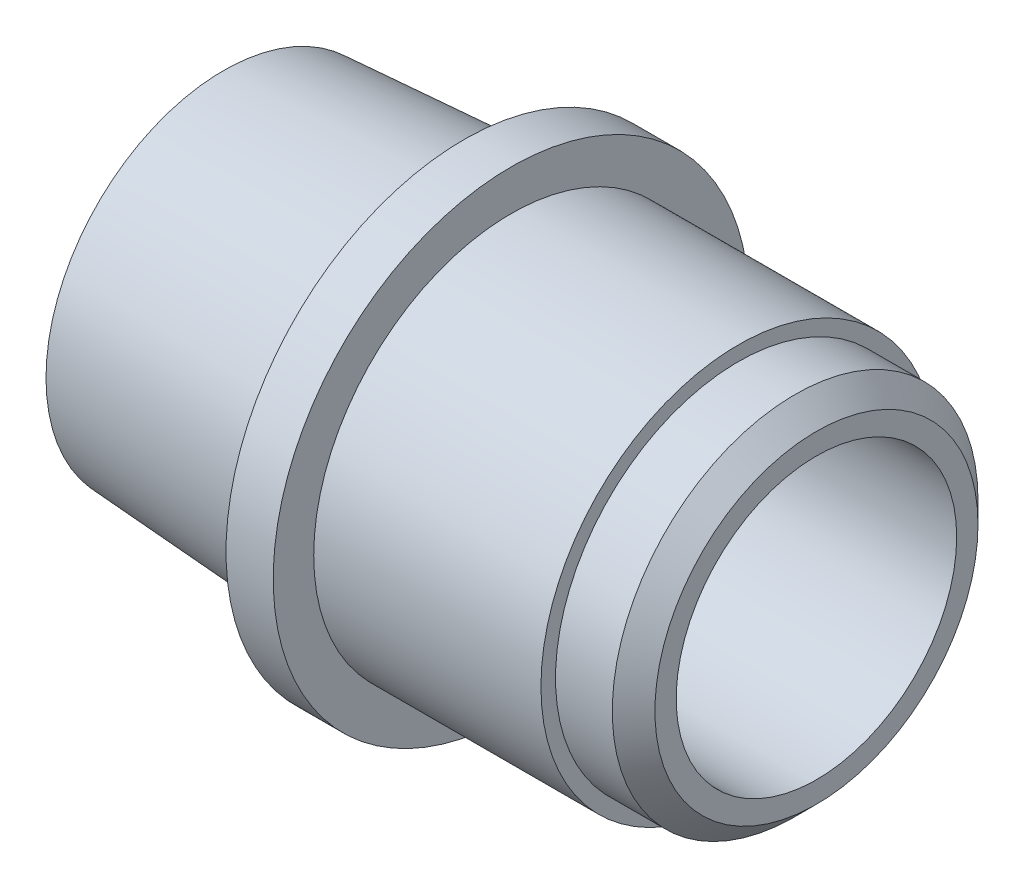
ISO-10303-21;
HEADER;
FILE_DESCRIPTION(('STEP AP214'),'2;1');
FILE_NAME('part.step','',(''),(''),'','','');
FILE_SCHEMA(('AUTOMOTIVE_DESIGN { 1 0 10303 214 1 1 1 1 }'));
ENDSEC;
DATA;
#1=APPLICATION_CONTEXT('core data for automotive mechanical design processes');
#2=APPLICATION_PROTOCOL_DEFINITION('international standard','automotive_design',2000,#1);
#3=PRODUCT_CONTEXT('',#1,'mechanical');
#4=PRODUCT('Part','Part','',(#3));
#5=PRODUCT_RELATED_PRODUCT_CATEGORY('part','',(#4));
#6=PRODUCT_DEFINITION_FORMATION('','',#4);
#7=PRODUCT_DEFINITION_CONTEXT('part definition',#1,'design');
#8=PRODUCT_DEFINITION('design','',#6,#7);
#9=PRODUCT_DEFINITION_SHAPE('','',#8);
#10=(LENGTH_UNIT() NAMED_UNIT(*) SI_UNIT(.MILLI.,.METRE.));
#11=(NAMED_UNIT(*) PLANE_ANGLE_UNIT() SI_UNIT($,.RADIAN.));
#12=(NAMED_UNIT(*) SI_UNIT($,.STERADIAN.) SOLID_ANGLE_UNIT());
#13=UNCERTAINTY_MEASURE_WITH_UNIT(LENGTH_MEASURE(1.E-05),#10,'distance_accuracy_value','');
#14=(GEOMETRIC_REPRESENTATION_CONTEXT(3) GLOBAL_UNCERTAINTY_ASSIGNED_CONTEXT((#13)) GLOBAL_UNIT_ASSIGNED_CONTEXT((#10,
#11,#12)) REPRESENTATION_CONTEXT('',''));
#15=CARTESIAN_POINT('',(0.,0.,0.));
#16=DIRECTION('',(0.,0.,1.));
#17=DIRECTION('',(1.,0.,0.));
#18=AXIS2_PLACEMENT_3D('',#15,#16,#17);
#19=CARTESIAN_POINT('',(21.209,8.509,0.));
#20=DIRECTION('',(1.,0.,0.));
#21=DIRECTION('',(0.,0.,-1.));
#22=AXIS2_PLACEMENT_3D('',#19,#20,#21);
#23=CYLINDRICAL_SURFACE('',#22,6.5405);
#24=CARTESIAN_POINT('',(20.447,8.509,0.));
#25=DIRECTION('',(1.,0.,0.));
#26=DIRECTION('',(0.,0.,-1.));
#27=AXIS2_PLACEMENT_3D('',#24,#25,#26);
#28=CIRCLE('',#27,6.5405);
#29=CARTESIAN_POINT('',(20.447,8.509,-6.5405));
#30=VERTEX_POINT('',#29);
#31=EDGE_CURVE('E38',#30,#30,#28,.T.);
#32=ORIENTED_EDGE('',*,*,#31,.F.);
#33=EDGE_LOOP('',(#32));
#34=FACE_BOUND('',#33,.T.);
#35=CARTESIAN_POINT('',(18.415,8.509,0.));
#36=DIRECTION('',(1.,0.,0.));
#37=DIRECTION('',(0.,0.,-1.));
#38=AXIS2_PLACEMENT_3D('',#35,#36,#37);
#39=CIRCLE('',#38,6.5405);
#40=CARTESIAN_POINT('',(18.415,8.509,-6.5405));
#41=VERTEX_POINT('',#40);
#42=EDGE_CURVE('E60',#41,#41,#39,.T.);
#43=ORIENTED_EDGE('',*,*,#42,.T.);
#44=EDGE_LOOP('',(#43));
#45=FACE_BOUND('',#44,.T.);
#46=ADVANCED_FACE('F32',(#34,#45),#23,.T.);
#47=CARTESIAN_POINT('',(20.447,8.509,0.));
#48=DIRECTION('',(-1.,0.,0.));
#49=DIRECTION('',(0.,0.,1.));
#50=AXIS2_PLACEMENT_3D('',#47,#48,#49);
#51=CONICAL_SURFACE('',#50,6.5405,0.785398163397451);
#52=CARTESIAN_POINT('',(21.209,8.509,0.));
#53=DIRECTION('',(1.,0.,0.));
#54=DIRECTION('',(0.,0.,-1.));
#55=AXIS2_PLACEMENT_3D('',#52,#53,#54);
#56=CIRCLE('',#55,5.7785);
#57=CARTESIAN_POINT('',(21.209,8.509,-5.7785));
#58=VERTEX_POINT('',#57);
#59=EDGE_CURVE('E42',#58,#58,#56,.T.);
#60=ORIENTED_EDGE('',*,*,#59,.F.);
#61=EDGE_LOOP('',(#60));
#62=FACE_BOUND('',#61,.T.);
#63=ORIENTED_EDGE('',*,*,#31,.T.);
#64=EDGE_LOOP('',(#63));
#65=FACE_BOUND('',#64,.T.);
#66=ADVANCED_FACE('F120',(#62,#65),#51,.T.);
#67=CARTESIAN_POINT('',(21.209,-7.72005150624623,0.));
#68=DIRECTION('',(-1.,0.,0.));
#69=DIRECTION('',(0.,0.,1.));
#70=AXIS2_PLACEMENT_3D('',#67,#68,#69);
#71=PLANE('',#70);
#72=CARTESIAN_POINT('',(21.209,8.509,0.));
#73=DIRECTION('',(1.,0.,0.));
#74=DIRECTION('',(0.,0.,-1.));
#75=AXIS2_PLACEMENT_3D('',#72,#73,#74);
#76=CIRCLE('',#75,5.0165);
#77=CARTESIAN_POINT('',(21.209,8.509,-5.0165));
#78=VERTEX_POINT('',#77);
#79=EDGE_CURVE('E104',#78,#78,#76,.T.);
#80=ORIENTED_EDGE('',*,*,#79,.F.);
#81=EDGE_LOOP('',(#80));
#82=FACE_BOUND('',#81,.T.);
#83=ORIENTED_EDGE('',*,*,#59,.T.);
#84=EDGE_LOOP('',(#83));
#85=FACE_BOUND('',#84,.T.);
#86=ADVANCED_FACE('F116',(#82,#85),#71,.F.);
#87=CARTESIAN_POINT('',(8.59789999999999,-7.72005150624623,0.));
#88=DIRECTION('',(-1.,0.,0.));
#89=DIRECTION('',(0.,0.,1.));
#90=AXIS2_PLACEMENT_3D('',#87,#88,#89);
#91=PLANE('',#90);
#92=CARTESIAN_POINT('',(8.59789999999999,8.509,0.));
#93=DIRECTION('',(-1.,0.,0.));
#94=DIRECTION('',(0.,0.,1.));
#95=AXIS2_PLACEMENT_3D('',#92,#93,#94);
#96=CIRCLE('',#95,6.89369073529412);
#97=CARTESIAN_POINT('',(8.59789999999999,8.509,6.89369073529412));
#98=VERTEX_POINT('',#97);
#99=EDGE_CURVE('E11',#98,#98,#96,.T.);
#100=ORIENTED_EDGE('',*,*,#99,.F.);
#101=EDGE_LOOP('',(#100));
#102=FACE_BOUND('',#101,.T.);
#103=CARTESIAN_POINT('',(8.59789999999999,8.509,0.));
#104=DIRECTION('',(1.,0.,0.));
#105=DIRECTION('',(0.,0.,-1.));
#106=AXIS2_PLACEMENT_3D('',#103,#104,#105);
#107=CIRCLE('',#106,8.509);
#108=CARTESIAN_POINT('',(8.59789999999999,8.509,-8.509));
#109=VERTEX_POINT('',#108);
#110=EDGE_CURVE('E46',#109,#109,#107,.T.);
#111=ORIENTED_EDGE('',*,*,#110,.F.);
#112=EDGE_LOOP('',(#111));
#113=FACE_BOUND('',#112,.T.);
#114=ADVANCED_FACE('F119',(#102,#113),#91,.T.);
#115=CARTESIAN_POINT('',(21.209,8.509,0.));
#116=DIRECTION('',(1.,0.,0.));
#117=DIRECTION('',(0.,0.,-1.));
#118=AXIS2_PLACEMENT_3D('',#115,#116,#117);
#119=CYLINDRICAL_SURFACE('',#118,8.509);
#120=CARTESIAN_POINT('',(10.287,8.509,0.));
#121=DIRECTION('',(1.,0.,0.));
#122=DIRECTION('',(0.,0.,-1.));
#123=AXIS2_PLACEMENT_3D('',#120,#121,#122);
#124=CIRCLE('',#123,8.509);
#125=CARTESIAN_POINT('',(10.287,8.509,-8.509));
#126=VERTEX_POINT('',#125);
#127=EDGE_CURVE('E51',#126,#126,#124,.T.);
#128=ORIENTED_EDGE('',*,*,#127,.F.);
#129=EDGE_LOOP('',(#128));
#130=FACE_BOUND('',#129,.T.);
#131=ORIENTED_EDGE('',*,*,#110,.T.);
#132=EDGE_LOOP('',(#131));
#133=FACE_BOUND('',#132,.T.);
#134=ADVANCED_FACE('F132',(#130,#133),#119,.T.);
#135=CARTESIAN_POINT('',(10.287,-7.72005150624623,0.));
#136=DIRECTION('',(1.,0.,0.));
#137=DIRECTION('',(0.,0.,-1.));
#138=AXIS2_PLACEMENT_3D('',#135,#136,#137);
#139=PLANE('',#138);
#140=ORIENTED_EDGE('',*,*,#127,.T.);
#141=EDGE_LOOP('',(#140));
#142=FACE_BOUND('',#141,.T.);
#143=CARTESIAN_POINT('',(10.287,8.509,0.));
#144=DIRECTION('',(1.,0.,0.));
#145=DIRECTION('',(0.,0.,-1.));
#146=AXIS2_PLACEMENT_3D('',#143,#144,#145);
#147=CIRCLE('',#146,7.0612);
#148=CARTESIAN_POINT('',(10.287,8.509,-7.0612));
#149=VERTEX_POINT('',#148);
#150=EDGE_CURVE('E54',#149,#149,#147,.T.);
#151=ORIENTED_EDGE('',*,*,#150,.F.);
#152=EDGE_LOOP('',(#151));
#153=FACE_BOUND('',#152,.T.);
#154=ADVANCED_FACE('F136',(#142,#153),#139,.T.);
#155=CARTESIAN_POINT('',(21.209,8.509,0.));
#156=DIRECTION('',(1.,0.,0.));
#157=DIRECTION('',(0.,0.,-1.));
#158=AXIS2_PLACEMENT_3D('',#155,#156,#157);
#159=CYLINDRICAL_SURFACE('',#158,7.0612);
#160=ORIENTED_EDGE('',*,*,#150,.T.);
#161=EDGE_LOOP('',(#160));
#162=FACE_BOUND('',#161,.T.);
#163=CARTESIAN_POINT('',(18.415,8.509,0.));
#164=DIRECTION('',(1.,0.,0.));
#165=DIRECTION('',(0.,0.,-1.));
#166=AXIS2_PLACEMENT_3D('',#163,#164,#165);
#167=CIRCLE('',#166,7.0612);
#168=CARTESIAN_POINT('',(18.415,8.509,-7.0612));
#169=VERTEX_POINT('',#168);
#170=EDGE_CURVE('E57',#169,#169,#167,.T.);
#171=ORIENTED_EDGE('',*,*,#170,.F.);
#172=EDGE_LOOP('',(#171));
#173=FACE_BOUND('',#172,.T.);
#174=ADVANCED_FACE('F139',(#162,#173),#159,.T.);
#175=CARTESIAN_POINT('',(18.415,-7.72005150624625,0.));
#176=DIRECTION('',(1.,0.,0.));
#177=DIRECTION('',(0.,0.,-1.));
#178=AXIS2_PLACEMENT_3D('',#175,#176,#177);
#179=PLANE('',#178);
#180=ORIENTED_EDGE('',*,*,#170,.T.);
#181=EDGE_LOOP('',(#180));
#182=FACE_BOUND('',#181,.T.);
#183=ORIENTED_EDGE('',*,*,#42,.F.);
#184=EDGE_LOOP('',(#183));
#185=FACE_BOUND('',#184,.T.);
#186=ADVANCED_FACE('F86',(#182,#185),#179,.T.);
#187=CARTESIAN_POINT('',(0.,8.509,0.));
#188=DIRECTION('',(1.,0.,0.));
#189=DIRECTION('',(0.,0.,-1.));
#190=AXIS2_PLACEMENT_3D('',#187,#188,#189);
#191=PLANE('',#190);
#192=CARTESIAN_POINT('',(0.,8.509,0.));
#193=DIRECTION('',(1.,0.,0.));
#194=DIRECTION('',(0.,0.,-1.));
#195=AXIS2_PLACEMENT_3D('',#192,#193,#194);
#196=CIRCLE('',#195,6.35);
#197=CARTESIAN_POINT('',(0.,8.509,-6.35));
#198=VERTEX_POINT('',#197);
#199=EDGE_CURVE('E63',#198,#198,#196,.T.);
#200=ORIENTED_EDGE('',*,*,#199,.F.);
#201=EDGE_LOOP('',(#200));
#202=FACE_BOUND('',#201,.T.);
#203=ADVANCED_FACE('F75',(#202),#191,.F.);
#204=CARTESIAN_POINT('',(0.,8.509,0.));
#205=DIRECTION('',(1.,0.,0.));
#206=DIRECTION('',(0.,0.,-1.));
#207=AXIS2_PLACEMENT_3D('',#204,#205,#206);
#208=CONICAL_SURFACE('',#207,6.35,0.0631512093889425);
#209=ORIENTED_EDGE('',*,*,#99,.T.);
#210=EDGE_LOOP('',(#209));
#211=FACE_BOUND('',#210,.T.);
#212=ORIENTED_EDGE('',*,*,#199,.T.);
#213=EDGE_LOOP('',(#212));
#214=FACE_BOUND('',#213,.T.);
#215=ADVANCED_FACE('F85',(#211,#214),#208,.T.);
#216=CARTESIAN_POINT('',(1.14299999999999,8.509,0.));
#217=DIRECTION('',(1.,0.,0.));
#218=DIRECTION('',(0.,0.,-1.));
#219=AXIS2_PLACEMENT_3D('',#216,#217,#218);
#220=CYLINDRICAL_SURFACE('',#219,5.0165);
#221=CARTESIAN_POINT('',(1.14299999999999,8.509,0.));
#222=DIRECTION('',(1.,0.,0.));
#223=DIRECTION('',(0.,0.,-1.));
#224=AXIS2_PLACEMENT_3D('',#221,#222,#223);
#225=CIRCLE('',#224,5.0165);
#226=CARTESIAN_POINT('',(1.14299999999999,8.509,-5.0165));
#227=VERTEX_POINT('',#226);
#228=EDGE_CURVE('E68',#227,#227,#225,.T.);
#229=ORIENTED_EDGE('',*,*,#228,.F.);
#230=EDGE_LOOP('',(#229));
#231=FACE_BOUND('',#230,.T.);
#232=ORIENTED_EDGE('',*,*,#79,.T.);
#233=EDGE_LOOP('',(#232));
#234=FACE_BOUND('',#233,.T.);
#235=ADVANCED_FACE('F88',(#231,#234),#220,.F.);
#236=CARTESIAN_POINT('',(1.14299999999999,8.509,0.));
#237=DIRECTION('',(1.,0.,0.));
#238=DIRECTION('',(0.,0.,-1.));
#239=AXIS2_PLACEMENT_3D('',#236,#237,#238);
#240=PLANE('',#239);
#241=ORIENTED_EDGE('',*,*,#228,.T.);
#242=EDGE_LOOP('',(#241));
#243=FACE_BOUND('',#242,.T.);
#244=ADVANCED_FACE('F110',(#243),#240,.T.);
#245=CLOSED_SHELL('',(#46,#66,#86,#114,#134,#154,#174,#186,#203,#215,#235,#244));
#246=MANIFOLD_SOLID_BREP('B2',#245);
#247=ADVANCED_BREP_SHAPE_REPRESENTATION('',(#18,#246),#14);
#248=SHAPE_DEFINITION_REPRESENTATION(#9,#247);
ENDSEC;
END-ISO-10303-21;
